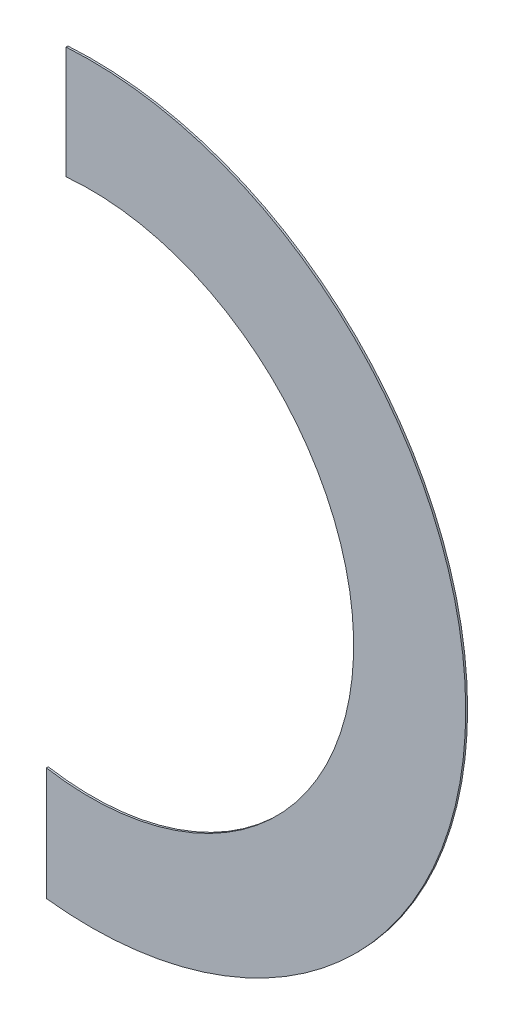
ISO-10303-21;
HEADER;
FILE_DESCRIPTION(('STEP AP214'),'2;1');
FILE_NAME('part.step','',(''),(''),'','','');
FILE_SCHEMA(('AUTOMOTIVE_DESIGN { 1 0 10303 214 1 1 1 1 }'));
ENDSEC;
DATA;
#1=APPLICATION_CONTEXT('core data for automotive mechanical design processes');
#2=APPLICATION_PROTOCOL_DEFINITION('international standard','automotive_design',2000,#1);
#3=PRODUCT_CONTEXT('',#1,'mechanical');
#4=PRODUCT('Part','Part','',(#3));
#5=PRODUCT_RELATED_PRODUCT_CATEGORY('part','',(#4));
#6=PRODUCT_DEFINITION_FORMATION('','',#4);
#7=PRODUCT_DEFINITION_CONTEXT('part definition',#1,'design');
#8=PRODUCT_DEFINITION('design','',#6,#7);
#9=PRODUCT_DEFINITION_SHAPE('','',#8);
#10=(LENGTH_UNIT() NAMED_UNIT(*) SI_UNIT(.MILLI.,.METRE.));
#11=(NAMED_UNIT(*) PLANE_ANGLE_UNIT() SI_UNIT($,.RADIAN.));
#12=(NAMED_UNIT(*) SI_UNIT($,.STERADIAN.) SOLID_ANGLE_UNIT());
#13=UNCERTAINTY_MEASURE_WITH_UNIT(LENGTH_MEASURE(1.E-05),#10,'distance_accuracy_value','');
#14=(GEOMETRIC_REPRESENTATION_CONTEXT(3) GLOBAL_UNCERTAINTY_ASSIGNED_CONTEXT((#13)) GLOBAL_UNIT_ASSIGNED_CONTEXT((#10,
#11,#12)) REPRESENTATION_CONTEXT('',''));
#15=CARTESIAN_POINT('',(0.,0.,0.));
#16=DIRECTION('',(0.,0.,1.));
#17=DIRECTION('',(1.,0.,0.));
#18=AXIS2_PLACEMENT_3D('',#15,#16,#17);
#19=CARTESIAN_POINT('',(2.338436630994,-9.091809427837,0.01));
#20=DIRECTION('',(0.,0.,1.));
#21=DIRECTION('',(1.,0.,0.));
#22=AXIS2_PLACEMENT_3D('',#19,#20,#21);
#23=PLANE('',#22);
#24=CARTESIAN_POINT('',(1.523557999989,-9.06674005449,0.01));
#25=DIRECTION('',(0.,0.,1.));
#26=DIRECTION('',(1.,0.,0.));
#27=AXIS2_PLACEMENT_3D('',#24,#25,#26);
#28=CIRCLE('',#27,1.397748453081);
#29=CARTESIAN_POINT('',(1.289939835104,-10.44482687727,0.01));
#30=VERTEX_POINT('',#29);
#31=CARTESIAN_POINT('',(1.394553210652,-7.674957563431,0.01));
#32=VERTEX_POINT('',#31);
#33=EDGE_CURVE('E73',#30,#32,#28,.T.);
#34=ORIENTED_EDGE('',*,*,#33,.F.);
#35=DIRECTION('',(0.,-1.,0.));
#36=VECTOR('',#35,1.);
#37=CARTESIAN_POINT('',(1.289939835104,-10.44482687727,0.01));
#38=LINE('',#37,#36);
#39=CARTESIAN_POINT('',(1.289939835104,-11.04567349723,0.01));
#40=VERTEX_POINT('',#39);
#41=EDGE_CURVE('E11',#30,#40,#38,.T.);
#42=ORIENTED_EDGE('',*,*,#41,.T.);
#43=CARTESIAN_POINT('',(1.523557999989,-9.06674005449,0.01));
#44=DIRECTION('',(0.,0.,1.));
#45=DIRECTION('',(1.,0.,0.));
#46=AXIS2_PLACEMENT_3D('',#43,#44,#45);
#47=CIRCLE('',#46,1.992675341789);
#48=CARTESIAN_POINT('',(1.394553210652,-7.078244949617,0.01));
#49=VERTEX_POINT('',#48);
#50=EDGE_CURVE('E75',#40,#49,#47,.T.);
#51=ORIENTED_EDGE('',*,*,#50,.T.);
#52=DIRECTION('',(0.,1.,0.));
#53=VECTOR('',#52,1.);
#54=CARTESIAN_POINT('',(1.394553210652,-7.674957563431,0.01));
#55=LINE('',#54,#53);
#56=EDGE_CURVE('E70',#32,#49,#55,.T.);
#57=ORIENTED_EDGE('',*,*,#56,.F.);
#58=EDGE_LOOP('',(#34,#42,#51,#57));
#59=FACE_BOUND('',#58,.T.);
#60=ADVANCED_FACE('F17',(#59),#23,.T.);
#61=CARTESIAN_POINT('',(2.338436630994,-9.091809427837,0.));
#62=DIRECTION('',(0.,0.,1.));
#63=DIRECTION('',(1.,0.,0.));
#64=AXIS2_PLACEMENT_3D('',#61,#62,#63);
#65=PLANE('',#64);
#66=CARTESIAN_POINT('',(1.523557999989,-9.06674005449,0.));
#67=DIRECTION('',(0.,0.,1.));
#68=DIRECTION('',(1.,0.,0.));
#69=AXIS2_PLACEMENT_3D('',#66,#67,#68);
#70=CIRCLE('',#69,1.397748453081);
#71=CARTESIAN_POINT('',(1.289939835104,-10.44482687727,0.));
#72=VERTEX_POINT('',#71);
#73=CARTESIAN_POINT('',(1.394553210652,-7.674957563431,0.));
#74=VERTEX_POINT('',#73);
#75=EDGE_CURVE('E81',#72,#74,#70,.T.);
#76=ORIENTED_EDGE('',*,*,#75,.T.);
#77=DIRECTION('',(0.,1.,0.));
#78=VECTOR('',#77,1.);
#79=CARTESIAN_POINT('',(1.394553210652,-7.674957563431,0.));
#80=LINE('',#79,#78);
#81=CARTESIAN_POINT('',(1.394553210652,-7.078244949617,0.));
#82=VERTEX_POINT('',#81);
#83=EDGE_CURVE('E87',#74,#82,#80,.T.);
#84=ORIENTED_EDGE('',*,*,#83,.T.);
#85=CARTESIAN_POINT('',(1.523557999989,-9.06674005449,0.));
#86=DIRECTION('',(0.,0.,1.));
#87=DIRECTION('',(1.,0.,0.));
#88=AXIS2_PLACEMENT_3D('',#85,#86,#87);
#89=CIRCLE('',#88,1.992675341789);
#90=CARTESIAN_POINT('',(1.289939835104,-11.04567349723,0.));
#91=VERTEX_POINT('',#90);
#92=EDGE_CURVE('E101',#91,#82,#89,.T.);
#93=ORIENTED_EDGE('',*,*,#92,.F.);
#94=DIRECTION('',(0.,-1.,0.));
#95=VECTOR('',#94,1.);
#96=CARTESIAN_POINT('',(1.289939835104,-10.44482687727,0.));
#97=LINE('',#96,#95);
#98=EDGE_CURVE('E21',#72,#91,#97,.T.);
#99=ORIENTED_EDGE('',*,*,#98,.F.);
#100=EDGE_LOOP('',(#76,#84,#93,#99));
#101=FACE_BOUND('',#100,.T.);
#102=ADVANCED_FACE('F19',(#101),#65,.F.);
#103=CARTESIAN_POINT('',(1.289939835104,-10.44482687727,0.));
#104=DIRECTION('',(1.,0.,0.));
#105=DIRECTION('',(0.,1.,0.));
#106=AXIS2_PLACEMENT_3D('',#103,#104,#105);
#107=PLANE('',#106);
#108=DIRECTION('',(0.,0.,1.));
#109=VECTOR('',#108,1.);
#110=CARTESIAN_POINT('',(1.289939835104,-10.44482687727,0.));
#111=LINE('',#110,#109);
#112=EDGE_CURVE('E94',#72,#30,#111,.T.);
#113=ORIENTED_EDGE('',*,*,#112,.F.);
#114=ORIENTED_EDGE('',*,*,#98,.T.);
#115=DIRECTION('',(0.,0.,1.));
#116=VECTOR('',#115,1.);
#117=CARTESIAN_POINT('',(1.289939835104,-11.04567349723,0.));
#118=LINE('',#117,#116);
#119=EDGE_CURVE('E104',#91,#40,#118,.T.);
#120=ORIENTED_EDGE('',*,*,#119,.T.);
#121=ORIENTED_EDGE('',*,*,#41,.F.);
#122=EDGE_LOOP('',(#113,#114,#120,#121));
#123=FACE_BOUND('',#122,.T.);
#124=ADVANCED_FACE('F147',(#123),#107,.F.);
#125=CARTESIAN_POINT('',(1.523557999989,-9.06674005449,0.));
#126=DIRECTION('',(0.,0.,-1.));
#127=DIRECTION('',(1.,0.,0.));
#128=AXIS2_PLACEMENT_3D('',#125,#126,#127);
#129=CYLINDRICAL_SURFACE('',#128,1.992675341789);
#130=ORIENTED_EDGE('',*,*,#119,.F.);
#131=ORIENTED_EDGE('',*,*,#92,.T.);
#132=DIRECTION('',(0.,0.,1.));
#133=VECTOR('',#132,1.);
#134=CARTESIAN_POINT('',(1.394553210652,-7.078244949617,0.));
#135=LINE('',#134,#133);
#136=EDGE_CURVE('E80',#82,#49,#135,.T.);
#137=ORIENTED_EDGE('',*,*,#136,.T.);
#138=ORIENTED_EDGE('',*,*,#50,.F.);
#139=EDGE_LOOP('',(#130,#131,#137,#138));
#140=FACE_BOUND('',#139,.T.);
#141=ADVANCED_FACE('F139',(#140),#129,.T.);
#142=CARTESIAN_POINT('',(1.394553210652,-7.674957563431,0.));
#143=DIRECTION('',(-1.,0.,0.));
#144=DIRECTION('',(0.,0.,1.));
#145=AXIS2_PLACEMENT_3D('',#142,#143,#144);
#146=PLANE('',#145);
#147=DIRECTION('',(0.,0.,1.));
#148=VECTOR('',#147,1.);
#149=CARTESIAN_POINT('',(1.394553210652,-7.674957563431,0.));
#150=LINE('',#149,#148);
#151=EDGE_CURVE('E84',#74,#32,#150,.T.);
#152=ORIENTED_EDGE('',*,*,#151,.T.);
#153=ORIENTED_EDGE('',*,*,#56,.T.);
#154=ORIENTED_EDGE('',*,*,#136,.F.);
#155=ORIENTED_EDGE('',*,*,#83,.F.);
#156=EDGE_LOOP('',(#152,#153,#154,#155));
#157=FACE_BOUND('',#156,.T.);
#158=ADVANCED_FACE('F85',(#157),#146,.T.);
#159=CARTESIAN_POINT('',(1.523557999989,-9.06674005449,0.));
#160=DIRECTION('',(0.,0.,-1.));
#161=DIRECTION('',(1.,0.,0.));
#162=AXIS2_PLACEMENT_3D('',#159,#160,#161);
#163=CYLINDRICAL_SURFACE('',#162,1.397748453081);
#164=ORIENTED_EDGE('',*,*,#112,.T.);
#165=ORIENTED_EDGE('',*,*,#33,.T.);
#166=ORIENTED_EDGE('',*,*,#151,.F.);
#167=ORIENTED_EDGE('',*,*,#75,.F.);
#168=EDGE_LOOP('',(#164,#165,#166,#167));
#169=FACE_BOUND('',#168,.T.);
#170=ADVANCED_FACE('F93',(#169),#163,.F.);
#171=CLOSED_SHELL('',(#60,#102,#124,#141,#158,#170));
#172=MANIFOLD_SOLID_BREP('B1',#171);
#173=ADVANCED_BREP_SHAPE_REPRESENTATION('',(#18,#172),#14);
#174=SHAPE_DEFINITION_REPRESENTATION(#9,#173);
ENDSEC;
END-ISO-10303-21;
